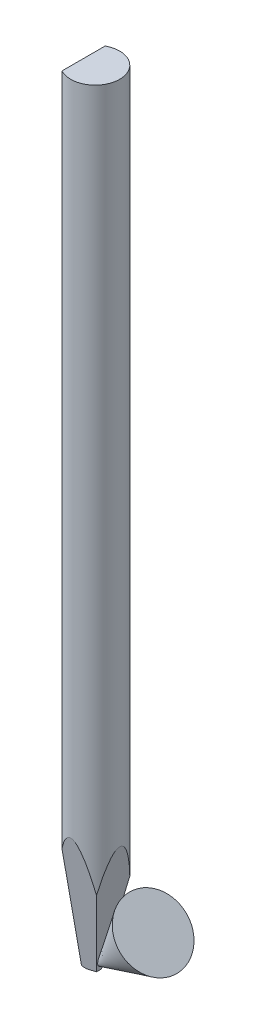
ISO-10303-21;
HEADER;
FILE_DESCRIPTION(('STEP AP214'),'2;1');
FILE_NAME('part.step','',(''),(''),'','','');
FILE_SCHEMA(('AUTOMOTIVE_DESIGN { 1 0 10303 214 1 1 1 1 }'));
ENDSEC;
DATA;
#1=APPLICATION_CONTEXT('core data for automotive mechanical design processes');
#2=APPLICATION_PROTOCOL_DEFINITION('international standard','automotive_design',2000,#1);
#3=PRODUCT_CONTEXT('',#1,'mechanical');
#4=PRODUCT('Part','Part','',(#3));
#5=PRODUCT_RELATED_PRODUCT_CATEGORY('part','',(#4));
#6=PRODUCT_DEFINITION_FORMATION('','',#4);
#7=PRODUCT_DEFINITION_CONTEXT('part definition',#1,'design');
#8=PRODUCT_DEFINITION('design','',#6,#7);
#9=PRODUCT_DEFINITION_SHAPE('','',#8);
#10=(LENGTH_UNIT() NAMED_UNIT(*) SI_UNIT(.MILLI.,.METRE.));
#11=(NAMED_UNIT(*) PLANE_ANGLE_UNIT() SI_UNIT($,.RADIAN.));
#12=(NAMED_UNIT(*) SI_UNIT($,.STERADIAN.) SOLID_ANGLE_UNIT());
#13=UNCERTAINTY_MEASURE_WITH_UNIT(LENGTH_MEASURE(1.E-05),#10,'distance_accuracy_value','');
#14=(GEOMETRIC_REPRESENTATION_CONTEXT(3) GLOBAL_UNCERTAINTY_ASSIGNED_CONTEXT((#13)) GLOBAL_UNIT_ASSIGNED_CONTEXT((#10,
#11,#12)) REPRESENTATION_CONTEXT('',''));
#15=CARTESIAN_POINT('',(0.,0.,0.));
#16=DIRECTION('',(0.,0.,1.));
#17=DIRECTION('',(1.,0.,0.));
#18=AXIS2_PLACEMENT_3D('',#15,#16,#17);
#19=CARTESIAN_POINT('',(-0.21082,0.,32.7173184204362));
#20=DIRECTION('',(-0.258819045102522,0.965925826289068,0.));
#21=DIRECTION('',(-0.965925826289068,-0.258819045102522,0.));
#22=AXIS2_PLACEMENT_3D('',#19,#20,#21);
#23=PLANE('',#22);
#24=DIRECTION('',(-0.965925826289068,-0.258819045102522,0.));
#25=VECTOR('',#24,1.);
#26=CARTESIAN_POINT('',(-0.21082,0.,0.0380999999999992));
#27=LINE('',#26,#25);
#28=CARTESIAN_POINT('',(-0.043939968,0.0447153698072801,0.0380999999999996));
#29=VERTEX_POINT('',#28);
#30=CARTESIAN_POINT('',(-0.198669324146965,0.00325576378231368,0.0381));
#31=VERTEX_POINT('',#30);
#32=EDGE_CURVE('E174',#29,#31,#27,.T.);
#33=ORIENTED_EDGE('',*,*,#32,.F.);
#34=DIRECTION('',(0.,0.,1.));
#35=VECTOR('',#34,1.);
#36=CARTESIAN_POINT('',(-0.0439399680000001,0.0447153698072801,32.7173184204362));
#37=LINE('',#36,#35);
#38=CARTESIAN_POINT('',(-0.043939968,0.0447153698072801,-0.0380999999999996));
#39=VERTEX_POINT('',#38);
#40=EDGE_CURVE('E12',#39,#29,#37,.T.);
#41=ORIENTED_EDGE('',*,*,#40,.F.);
#42=DIRECTION('',(-0.965925826289068,-0.258819045102522,0.));
#43=VECTOR('',#42,1.);
#44=CARTESIAN_POINT('',(-0.21082,0.,-0.0380999999999992));
#45=LINE('',#44,#43);
#46=CARTESIAN_POINT('',(-0.198669324146965,0.00325576378231368,-0.0381));
#47=VERTEX_POINT('',#46);
#48=EDGE_CURVE('E171',#39,#47,#45,.T.);
#49=ORIENTED_EDGE('',*,*,#48,.T.);
#50=CARTESIAN_POINT('',(-1.68012840293986,-0.3937,0.));
#51=DIRECTION('',(-0.258819045102522,0.965925826289068,0.));
#52=DIRECTION('',(-0.965925826289068,-0.258819045102522,0.));
#53=AXIS2_PLACEMENT_3D('',#50,#51,#52);
#54=ELLIPSE('',#53,1.54076760403021,0.39878);
#55=CARTESIAN_POINT('',(-0.210819999999997,0.,-0.063474589831864));
#56=VERTEX_POINT('',#55);
#57=EDGE_CURVE('E176',#47,#56,#54,.T.);
#58=ORIENTED_EDGE('',*,*,#57,.T.);
#59=DIRECTION('',(0.964921520309631,0.258549942126378,-0.0455893306574928));
#60=VECTOR('',#59,1.);
#61=CARTESIAN_POINT('',(30.0732612412349,8.11459511210743,-1.49432205578958));
#62=LINE('',#61,#60);
#63=CARTESIAN_POINT('',(0.12242470321684,0.0892926491088998,-0.0792447032168328));
#64=VERTEX_POINT('',#63);
#65=EDGE_CURVE('E262',#56,#64,#62,.T.);
#66=ORIENTED_EDGE('',*,*,#65,.T.);
#67=DIRECTION('',(0.,0.,-1.));
#68=VECTOR('',#67,1.);
#69=CARTESIAN_POINT('',(0.122424703216833,0.0892926491088998,32.7173184204362));
#70=LINE('',#69,#68);
#71=CARTESIAN_POINT('',(0.12242470321684,0.0892926491088998,0.0792447032168328));
#72=VERTEX_POINT('',#71);
#73=EDGE_CURVE('E228',#72,#64,#70,.T.);
#74=ORIENTED_EDGE('',*,*,#73,.F.);
#75=DIRECTION('',(-0.964921520309631,-0.258549942126378,-0.0455893306574928));
#76=VECTOR('',#75,1.);
#77=CARTESIAN_POINT('',(30.0732612412349,8.11459511210743,1.49432205578958));
#78=LINE('',#77,#76);
#79=CARTESIAN_POINT('',(-0.210819999999994,0.,0.063474589831864));
#80=VERTEX_POINT('',#79);
#81=EDGE_CURVE('E237',#72,#80,#78,.T.);
#82=ORIENTED_EDGE('',*,*,#81,.T.);
#83=EDGE_CURVE('E218',#80,#31,#54,.T.);
#84=ORIENTED_EDGE('',*,*,#83,.T.);
#85=EDGE_LOOP('',(#33,#41,#49,#58,#66,#74,#82,#84));
#86=FACE_BOUND('',#85,.T.);
#87=ADVANCED_FACE('F51',(#86),#23,.F.);
#88=CARTESIAN_POINT('',(32.267537028911,-0.3937,0.));
#89=DIRECTION('',(-1.,0.,0.));
#90=DIRECTION('',(0.,0.,1.));
#91=AXIS2_PLACEMENT_3D('',#88,#89,#90);
#92=CYLINDRICAL_SURFACE('',#91,0.39878);
#93=DIRECTION('',(-1.,0.,0.));
#94=VECTOR('',#93,1.);
#95=CARTESIAN_POINT('',(32.267537028911,0.00325576378231368,0.0381));
#96=LINE('',#95,#94);
#97=CARTESIAN_POINT('',(-0.213434975324446,0.00325576378231347,0.0381));
#98=VERTEX_POINT('',#97);
#99=EDGE_CURVE('E59',#31,#98,#96,.T.);
#100=ORIENTED_EDGE('',*,*,#99,.F.);
#101=ORIENTED_EDGE('',*,*,#83,.F.);
#102=CARTESIAN_POINT('',(-0.210819999999994,0.,0.0634491796637279));
#103=DIRECTION('',(-1.,0.,0.));
#104=VECTOR('',#103,1.);
#105=LINE('',#102,#104);
#106=CARTESIAN_POINT('',(-0.337820000000001,0.,0.0634745898318631));
#107=VERTEX_POINT('',#106);
#108=EDGE_CURVE('E74',#80,#107,#105,.T.);
#109=ORIENTED_EDGE('',*,*,#108,.T.);
#110=CARTESIAN_POINT('',(-0.33782,0.,-0.0634491796637279));
#111=CARTESIAN_POINT('',(-0.338215230170378,-2.1619663506246E-07,-0.0634504140289411));
#112=CARTESIAN_POINT('',(-0.338608680576224,6.1408026914369E-06,-0.0634110825976376));
#113=CARTESIAN_POINT('',(-0.339376539166161,2.9956330626349E-05,-0.0632630918013469));
#114=CARTESIAN_POINT('',(-0.339751136439136,4.72587329837486E-05,-0.0631554073575771));
#115=CARTESIAN_POINT('',(-0.340566424134218,9.63849822904999E-05,-0.0628484147691743));
#116=CARTESIAN_POINT('',(-0.341000799813187,0.000130729155729543,-0.0626331151866348));
#117=CARTESIAN_POINT('',(-0.341830879332213,0.000209401615022684,-0.0621364323829714));
#118=CARTESIAN_POINT('',(-0.342226343023016,0.000253786925260052,-0.0618546713159871));
#119=CARTESIAN_POINT('',(-0.343246193379579,0.000382750525198559,-0.0610290655842789));
#120=CARTESIAN_POINT('',(-0.343833692448088,0.000473486412576475,-0.0604412062287345));
#121=CARTESIAN_POINT('',(-0.344919050465909,0.000663233768986585,-0.0591907067245966));
#122=CARTESIAN_POINT('',(-0.345416712083611,0.000762262772703951,-0.0585279070337537));
#123=CARTESIAN_POINT('',(-0.347199317449133,0.00114717632260984,-0.0559014765020926));
#124=CARTESIAN_POINT('',(-0.348251269256303,0.00144216221478851,-0.0537847031790454));
#125=CARTESIAN_POINT('',(-0.350067330775089,0.00201087949910872,-0.0494307127625433));
#126=CARTESIAN_POINT('',(-0.350829658162979,0.00228447130814355,-0.047192843714313));
#127=CARTESIAN_POINT('',(-0.353601902976201,0.00334391714965828,-0.0378407235029386));
#128=CARTESIAN_POINT('',(-0.354816203935163,0.00398146647630368,-0.0304796839666097));
#129=CARTESIAN_POINT('',(-0.356420207927863,0.0048439888571872,-0.0156396189486946));
#130=CARTESIAN_POINT('',(-0.356804845155496,0.00506642619291586,-0.00816014797449113));
#131=CARTESIAN_POINT('',(-0.356850729381507,0.00509381728214254,0.00760774573397564));
#132=CARTESIAN_POINT('',(-0.356429012575582,0.00485088554254846,0.0158959420507874));
#133=CARTESIAN_POINT('',(-0.354573892929132,0.00385184669696223,0.0322958260830371));
#134=CARTESIAN_POINT('',(-0.353153510899978,0.00310234912265248,0.0404084150959362));
#135=CARTESIAN_POINT('',(-0.35013678994009,0.00204453529520439,0.0491211397037176));
#136=CARTESIAN_POINT('',(-0.349758655989933,0.00191644202880441,0.0501414810048737));
#137=CARTESIAN_POINT('',(-0.348937773713734,0.0016554554041729,0.0521591104339088));
#138=CARTESIAN_POINT('',(-0.348494839476784,0.00152254909191717,0.0531563223322797));
#139=CARTESIAN_POINT('',(-0.347469420243984,0.00123789714403849,0.0552338944388721));
#140=CARTESIAN_POINT('',(-0.346876413821046,0.00108587247117545,0.0563090757935718));
#141=CARTESIAN_POINT('',(-0.345551032354156,0.000786327429640935,0.0583702528176114));
#142=CARTESIAN_POINT('',(-0.344819355100165,0.000638788626588872,0.0593566600314393));
#143=CARTESIAN_POINT('',(-0.343649511930445,0.000447125744975873,0.0606108046377649));
#144=CARTESIAN_POINT('',(-0.343296857408712,0.000393842380942738,0.0609560541267325));
#145=CARTESIAN_POINT('',(-0.342551887573586,0.000293102249135745,0.0616038141185952));
#146=CARTESIAN_POINT('',(-0.342159521419922,0.000245653127084535,0.0619062686156061));
#147=CARTESIAN_POINT('',(-0.341325280448744,0.000159233790517246,0.0624537483118446));
#148=CARTESIAN_POINT('',(-0.340882694253593,0.000120416755111992,0.0626977411744304));
#149=CARTESIAN_POINT('',(-0.339957773274714,5.72497829757817E-05,0.0630932473964741));
#150=CARTESIAN_POINT('',(-0.339475683317333,3.28174315595638E-05,0.0632452877223534));
#151=CARTESIAN_POINT('',(-0.338791609164942,1.19029071700359E-05,0.06337528740311));
#152=CARTESIAN_POINT('',(-0.338598720198571,7.46593887915602E-06,0.0634028402213453));
#153=CARTESIAN_POINT('',(-0.338210609295611,1.50657797810939E-06,0.0634398324418317));
#154=CARTESIAN_POINT('',(-0.338015382206792,-7.30368063465796E-09,0.0634492189506669));
#155=CARTESIAN_POINT('',(-0.337820000000033,0.,0.0634491796639003));
#156=B_SPLINE_CURVE_WITH_KNOTS('',3,(#110,#111,#112,#113,#114,#115,#116,#117,#118,#119,#120,
#121,#122,#123,#124,#125,#126,#127,#128,#129,#130,#131,#132,#133,#134,#135,#136,#137,#138,#139,
#140,#141,#142,#143,#144,#145,#146,#147,#148,#149,#150,#151,#152,#153,#154,#155),.UNSPECIFIED.,
.F.,.F.,(4,2,2,2,2,2,2,2,2,2,2,2,2,2,2,2,2,2,2,2,2,2,4),(0.,0.00118082886348373,
0.00234518277421218,0.00379502494241527,0.00525331731965551,0.00774730261493331,
0.0102467011047661,0.0173371002717175,0.0244704523774037,0.0467777779045145,0.0692209276345487,
0.0940977103997022,0.118656018375932,0.121941221326841,0.125236041342339,0.128942534466866,
0.132630849292132,0.134117486211074,0.135606051047257,0.137119230412516,0.138623653705772,
0.13920758327759,0.139793210488499),.UNSPECIFIED.);
#157=CARTESIAN_POINT('',(-0.337820000000001,0.,-0.0634745898318645));
#158=VERTEX_POINT('',#157);
#159=EDGE_CURVE('E214',#158,#107,#156,.T.);
#160=ORIENTED_EDGE('',*,*,#159,.F.);
#161=CARTESIAN_POINT('',(-0.210820000000007,0.,-0.0635000000000002));
#162=DIRECTION('',(-1.,0.,0.));
#163=VECTOR('',#162,1.);
#164=LINE('',#161,#163);
#165=EDGE_CURVE('E242',#56,#158,#164,.T.);
#166=ORIENTED_EDGE('',*,*,#165,.F.);
#167=ORIENTED_EDGE('',*,*,#57,.F.);
#168=DIRECTION('',(-1.,0.,0.));
#169=VECTOR('',#168,1.);
#170=CARTESIAN_POINT('',(32.267537028911,0.00325576378231368,-0.0381));
#171=LINE('',#170,#169);
#172=CARTESIAN_POINT('',(-0.213434975324446,0.00325576378231446,-0.0381));
#173=VERTEX_POINT('',#172);
#174=EDGE_CURVE('E219',#47,#173,#171,.T.);
#175=ORIENTED_EDGE('',*,*,#174,.T.);
#176=CARTESIAN_POINT('',(-0.213434975324448,0.0032557637823121,-0.0381));
#177=CARTESIAN_POINT('',(-0.216677356144413,0.00325383969481455,-0.0381024345546639));
#178=CARTESIAN_POINT('',(-0.219929187359219,0.00328486987693439,-0.0377957846025672));
#179=CARTESIAN_POINT('',(-0.226328276823231,0.00340247139150545,-0.0365497108956549));
#180=CARTESIAN_POINT('',(-0.229474748255872,0.00348939100053903,-0.0356063174105322));
#181=CARTESIAN_POINT('',(-0.235038569200649,0.00369156598219943,-0.0332640592973628));
#182=CARTESIAN_POINT('',(-0.237494118474574,0.0038005228798271,-0.0319559953546052));
#183=CARTESIAN_POINT('',(-0.242096763884266,0.00403517428488462,-0.028889214713774));
#184=CARTESIAN_POINT('',(-0.244244911132795,0.00416080877937995,-0.0271320938616095));
#185=CARTESIAN_POINT('',(-0.247867020057944,0.00439245800745617,-0.0234685409816757));
#186=CARTESIAN_POINT('',(-0.249392685597249,0.00449885496890007,-0.0216132654121546));
#187=CARTESIAN_POINT('',(-0.252059477706641,0.00469451637626385,-0.0176417261337415));
#188=CARTESIAN_POINT('',(-0.253200739665995,0.00478378684945852,-0.0155255546734358));
#189=CARTESIAN_POINT('',(-0.254922624590094,0.0049223627266547,-0.0113782123586908));
#190=CARTESIAN_POINT('',(-0.255554874234946,0.00497522902986715,-0.00936849985669344));
#191=CARTESIAN_POINT('',(-0.256445735610066,0.00505046238868644,-0.00526776612211923));
#192=CARTESIAN_POINT('',(-0.256704586644332,0.00507284897763974,-0.00317679784811331));
#193=CARTESIAN_POINT('',(-0.256832033773111,0.00508382922425374,0.000870511032522582));
#194=CARTESIAN_POINT('',(-0.256726572149323,0.00507466940950495,0.00282607750329771));
#195=CARTESIAN_POINT('',(-0.256186703007007,0.00502855002735404,0.00669067553085059));
#196=CARTESIAN_POINT('',(-0.255752331354908,0.00499159349108511,0.00859971213811182));
#197=CARTESIAN_POINT('',(-0.254577692720403,0.00489447221036392,0.0123020389950609));
#198=CARTESIAN_POINT('',(-0.253840075814913,0.00483450881974658,0.0140961800945649));
#199=CARTESIAN_POINT('',(-0.252087432851536,0.00469770885428753,0.0175423096927673));
#200=CARTESIAN_POINT('',(-0.251072364768344,0.00462086972363786,0.0191942766065744));
#201=CARTESIAN_POINT('',(-0.248747537370778,0.00445412054850273,0.0223935712414367));
#202=CARTESIAN_POINT('',(-0.247426322164297,0.00436377040576979,0.0239325286663827));
#203=CARTESIAN_POINT('',(-0.244563703416135,0.0041817680138569,0.0267888028979574));
#204=CARTESIAN_POINT('',(-0.243022250556546,0.00409011547718224,0.0281060699170829));
#205=CARTESIAN_POINT('',(-0.239616689144949,0.00390558792775978,0.0306105478907787));
#206=CARTESIAN_POINT('',(-0.237736008509374,0.00381335175475867,0.0317752284066294));
#207=CARTESIAN_POINT('',(-0.233820769163239,0.00364533110349437,0.0338115681906488));
#208=CARTESIAN_POINT('',(-0.23178607425588,0.00356956142143786,0.0346829643063795));
#209=CARTESIAN_POINT('',(-0.227364937688427,0.00343283400813629,0.0362169384546261));
#210=CARTESIAN_POINT('',(-0.224965499517075,0.00337472372481431,0.0368421771277457));
#211=CARTESIAN_POINT('',(-0.220103176679321,0.00329161310799441,0.0377272958744222));
#212=CARTESIAN_POINT('',(-0.21764038982262,0.00326656452830056,0.0379877083647506));
#213=CARTESIAN_POINT('',(-0.21459447285549,0.00325668904295385,0.0380902897493966));
#214=CARTESIAN_POINT('',(-0.214014625789137,0.00325575167602871,0.0381000144233923));
#215=CARTESIAN_POINT('',(-0.213434975324448,0.00325576378231369,0.0381));
#216=B_SPLINE_CURVE_WITH_KNOTS('',3,(#176,#177,#178,#179,#180,#181,#182,#183,#184,#185,#186,
#187,#188,#189,#190,#191,#192,#193,#194,#195,#196,#197,#198,#199,#200,#201,#202,#203,#204,#205,
#206,#207,#208,#209,#210,#211,#212,#213,#214,#215),.UNSPECIFIED.,.F.,.F.,(4,2,2,2,2,2,2,2,2,2,2,
2,2,2,2,2,2,2,2,4),(0.,0.00972822348330293,0.0195176640268306,0.0278221058027812,
0.0360974362047185,0.0432692472929993,0.0504385297782022,0.056727673438183,0.06301278471331,
0.0688598408747795,0.074706259528079,0.0805026368509789,0.0862998926334656,0.0923652055792211,
0.0984318788679133,0.105047118690686,0.111668278379351,0.119079743158159,0.126480380552625,
0.128219781100697),.UNSPECIFIED.);
#217=EDGE_CURVE('E309',#173,#98,#216,.T.);
#218=ORIENTED_EDGE('',*,*,#217,.T.);
#219=EDGE_LOOP('',(#100,#101,#109,#160,#166,#167,#175,#218));
#220=FACE_BOUND('',#219,.T.);
#221=ADVANCED_FACE('F184',(#220),#92,.F.);
#222=CARTESIAN_POINT('',(32.315162028911,0.,0.0635));
#223=DIRECTION('',(0.,-0.173648177666931,0.984807753012208));
#224=DIRECTION('',(0.,-0.984807753012208,-0.173648177666931));
#225=AXIS2_PLACEMENT_3D('',#222,#223,#224);
#226=PLANE('',#225);
#227=CARTESIAN_POINT('',(-0.33782,0.0381,0.0702180579649908));
#228=DIRECTION('',(0.,-0.173648177666931,0.984807753012208));
#229=DIRECTION('',(0.,-0.984807753012208,-0.173648177666931));
#230=AXIS2_PLACEMENT_3D('',#227,#228,#229);
#231=ELLIPSE('',#230,0.0386877539128469,0.0381);
#232=CARTESIAN_POINT('',(-0.37592,0.0381,0.0702180579649908));
#233=VERTEX_POINT('',#232);
#234=EDGE_CURVE('E227',#107,#233,#231,.F.);
#235=ORIENTED_EDGE('',*,*,#234,.F.);
#236=ORIENTED_EDGE('',*,*,#108,.F.);
#237=ORIENTED_EDGE('',*,*,#81,.F.);
#238=DIRECTION('',(-0.171087869746036,-0.970287525247814,-0.171087869746036));
#239=VECTOR('',#238,1.);
#240=CARTESIAN_POINT('',(1.0494563833806,5.34675056303125,1.00627638338059));
#241=LINE('',#240,#239);
#242=CARTESIAN_POINT('',(0.581541914989137,2.69307574530669,0.538361914989131));
#243=VERTEX_POINT('',#242);
#244=EDGE_CURVE('E234',#243,#72,#241,.T.);
#245=ORIENTED_EDGE('',*,*,#244,.F.);
#246=CARTESIAN_POINT('',(0.,-0.360126395545723,0.));
#247=DIRECTION('',(0.,-0.173648177666931,0.984807753012208));
#248=DIRECTION('',(0.,-0.984807753012208,-0.173648177666931));
#249=AXIS2_PLACEMENT_3D('',#246,#247,#248);
#250=ELLIPSE('',#249,4.56371043248163,0.792479999999998);
#251=CARTESIAN_POINT('',(-0.37592,3.596415651605,0.69764511322018));
#252=VERTEX_POINT('',#251);
#253=EDGE_CURVE('E238',#243,#252,#250,.T.);
#254=ORIENTED_EDGE('',*,*,#253,.T.);
#255=DIRECTION('',(0.,0.984807753012208,0.173648177666931));
#256=VECTOR('',#255,1.);
#257=CARTESIAN_POINT('',(-0.37592,24.4442785246367,4.37368582784599));
#258=LINE('',#257,#256);
#259=EDGE_CURVE('E254',#233,#252,#258,.T.);
#260=ORIENTED_EDGE('',*,*,#259,.F.);
#261=EDGE_LOOP('',(#235,#236,#237,#245,#254,#260));
#262=FACE_BOUND('',#261,.T.);
#263=ADVANCED_FACE('F194',(#262),#226,.T.);
#264=CARTESIAN_POINT('',(32.315162028911,0.,-0.0635));
#265=DIRECTION('',(0.,-0.173648177666931,-0.984807753012208));
#266=DIRECTION('',(0.,0.984807753012208,-0.173648177666931));
#267=AXIS2_PLACEMENT_3D('',#264,#265,#266);
#268=PLANE('',#267);
#269=CARTESIAN_POINT('',(-0.33782,0.0381,-0.0702180579649908));
#270=DIRECTION('',(0.,-0.173648177666931,-0.984807753012208));
#271=DIRECTION('',(0.,0.984807753012208,-0.173648177666931));
#272=AXIS2_PLACEMENT_3D('',#269,#270,#271);
#273=ELLIPSE('',#272,0.0386877539128469,0.0381);
#274=CARTESIAN_POINT('',(-0.37592,0.0381,-0.0702180579649908));
#275=VERTEX_POINT('',#274);
#276=EDGE_CURVE('E301',#275,#158,#273,.F.);
#277=ORIENTED_EDGE('',*,*,#276,.F.);
#278=DIRECTION('',(0.,-0.984807753012208,0.173648177666931));
#279=VECTOR('',#278,1.);
#280=CARTESIAN_POINT('',(-0.37592,24.8021957642242,-4.43679629404595));
#281=LINE('',#280,#279);
#282=CARTESIAN_POINT('',(-0.37592,3.596415651605,-0.69764511322018));
#283=VERTEX_POINT('',#282);
#284=EDGE_CURVE('E256',#283,#275,#281,.T.);
#285=ORIENTED_EDGE('',*,*,#284,.F.);
#286=CARTESIAN_POINT('',(0.,-0.360126395545723,0.));
#287=DIRECTION('',(0.,-0.173648177666931,-0.984807753012208));
#288=DIRECTION('',(0.,-0.984807753012208,0.173648177666931));
#289=AXIS2_PLACEMENT_3D('',#286,#287,#288);
#290=ELLIPSE('',#289,4.56371043248163,0.792479999999998);
#291=CARTESIAN_POINT('',(0.581541914989137,2.69307574530669,-0.538361914989131));
#292=VERTEX_POINT('',#291);
#293=EDGE_CURVE('E241',#283,#292,#290,.T.);
#294=ORIENTED_EDGE('',*,*,#293,.T.);
#295=DIRECTION('',(0.171087869746036,0.970287525247814,-0.171087869746036));
#296=VECTOR('',#295,1.);
#297=CARTESIAN_POINT('',(1.0494563833806,5.34675056303125,-1.00627638338059));
#298=LINE('',#297,#296);
#299=EDGE_CURVE('E259',#64,#292,#298,.T.);
#300=ORIENTED_EDGE('',*,*,#299,.F.);
#301=ORIENTED_EDGE('',*,*,#65,.F.);
#302=ORIENTED_EDGE('',*,*,#165,.T.);
#303=EDGE_LOOP('',(#277,#285,#294,#300,#301,#302));
#304=FACE_BOUND('',#303,.T.);
#305=ADVANCED_FACE('F281',(#304),#268,.T.);
#306=CARTESIAN_POINT('',(0.,25.4,0.));
#307=DIRECTION('',(0.,-1.,0.));
#308=DIRECTION('',(0.,0.,-1.));
#309=AXIS2_PLACEMENT_3D('',#306,#307,#308);
#310=CYLINDRICAL_SURFACE('',#309,0.792479999999998);
#311=ORIENTED_EDGE('',*,*,#253,.F.);
#312=CARTESIAN_POINT('',(0.,-0.605012344516816,0.));
#313=DIRECTION('',(-0.984807753012208,0.173648177666931,0.));
#314=DIRECTION('',(-0.173648177666931,-0.984807753012208,0.));
#315=AXIS2_PLACEMENT_3D('',#312,#313,#314);
#316=ELLIPSE('',#315,4.56371043248165,0.792479999999998);
#317=EDGE_CURVE('E231',#243,#292,#316,.T.);
#318=ORIENTED_EDGE('',*,*,#317,.T.);
#319=ORIENTED_EDGE('',*,*,#293,.F.);
#320=DIRECTION('',(0.,-1.,0.));
#321=VECTOR('',#320,1.);
#322=CARTESIAN_POINT('',(-0.37592,25.4,-0.69764511322018));
#323=LINE('',#322,#321);
#324=CARTESIAN_POINT('',(-0.37592,25.4,-0.69764511322018));
#325=VERTEX_POINT('',#324);
#326=EDGE_CURVE('E248',#325,#283,#323,.T.);
#327=ORIENTED_EDGE('',*,*,#326,.F.);
#328=CARTESIAN_POINT('',(0.,25.4,0.));
#329=DIRECTION('',(0.,1.,0.));
#330=DIRECTION('',(0.,0.,1.));
#331=AXIS2_PLACEMENT_3D('',#328,#329,#330);
#332=CIRCLE('',#331,0.792479999999998);
#333=CARTESIAN_POINT('',(-0.37592,25.4,0.69764511322018));
#334=VERTEX_POINT('',#333);
#335=EDGE_CURVE('E251',#334,#325,#332,.T.);
#336=ORIENTED_EDGE('',*,*,#335,.F.);
#337=DIRECTION('',(0.,-1.,0.));
#338=VECTOR('',#337,1.);
#339=CARTESIAN_POINT('',(-0.37592,25.4,0.69764511322018));
#340=LINE('',#339,#338);
#341=EDGE_CURVE('E246',#252,#334,#340,.F.);
#342=ORIENTED_EDGE('',*,*,#341,.F.);
#343=EDGE_LOOP('',(#311,#318,#319,#327,#336,#342));
#344=FACE_BOUND('',#343,.T.);
#345=ADVANCED_FACE('F53',(#344),#310,.T.);
#346=CARTESIAN_POINT('',(-0.37592,25.4,-1.04648));
#347=DIRECTION('',(-1.,0.,0.));
#348=DIRECTION('',(0.,0.,1.));
#349=AXIS2_PLACEMENT_3D('',#346,#347,#348);
#350=PLANE('',#349);
#351=DIRECTION('',(0.,0.,-1.));
#352=VECTOR('',#351,1.);
#353=CARTESIAN_POINT('',(-0.37592,0.0381,31.924637028911));
#354=LINE('',#353,#352);
#355=EDGE_CURVE('E223',#233,#275,#354,.T.);
#356=ORIENTED_EDGE('',*,*,#355,.F.);
#357=ORIENTED_EDGE('',*,*,#259,.T.);
#358=ORIENTED_EDGE('',*,*,#341,.T.);
#359=DIRECTION('',(0.,0.,-1.));
#360=VECTOR('',#359,1.);
#361=CARTESIAN_POINT('',(-0.37592,25.4,-1.04648));
#362=LINE('',#361,#360);
#363=EDGE_CURVE('E244',#334,#325,#362,.T.);
#364=ORIENTED_EDGE('',*,*,#363,.T.);
#365=ORIENTED_EDGE('',*,*,#326,.T.);
#366=ORIENTED_EDGE('',*,*,#284,.T.);
#367=EDGE_LOOP('',(#356,#357,#358,#364,#365,#366));
#368=FACE_BOUND('',#367,.T.);
#369=ADVANCED_FACE('F286',(#368),#350,.T.);
#370=CARTESIAN_POINT('',(0.,25.4,0.));
#371=DIRECTION('',(0.,1.,0.));
#372=DIRECTION('',(0.,0.,1.));
#373=AXIS2_PLACEMENT_3D('',#370,#371,#372);
#374=PLANE('',#373);
#375=ORIENTED_EDGE('',*,*,#335,.T.);
#376=ORIENTED_EDGE('',*,*,#363,.F.);
#377=EDGE_LOOP('',(#375,#376));
#378=FACE_BOUND('',#377,.T.);
#379=ADVANCED_FACE('F337',(#378),#374,.T.);
#380=CARTESIAN_POINT('',(0.122424703216833,0.0892926491088998,32.7173184204362));
#381=DIRECTION('',(-0.984807753012208,0.173648177666931,0.));
#382=DIRECTION('',(-0.173648177666931,-0.984807753012208,0.));
#383=AXIS2_PLACEMENT_3D('',#380,#381,#382);
#384=PLANE('',#383);
#385=ORIENTED_EDGE('',*,*,#317,.F.);
#386=ORIENTED_EDGE('',*,*,#244,.T.);
#387=ORIENTED_EDGE('',*,*,#73,.T.);
#388=ORIENTED_EDGE('',*,*,#299,.T.);
#389=EDGE_LOOP('',(#385,#386,#387,#388));
#390=FACE_BOUND('',#389,.T.);
#391=ADVANCED_FACE('F326',(#390),#384,.F.);
#392=CARTESIAN_POINT('',(-0.33782,0.0381,31.924637028911));
#393=DIRECTION('',(0.,0.,-1.));
#394=DIRECTION('',(-1.,0.,0.));
#395=AXIS2_PLACEMENT_3D('',#392,#393,#394);
#396=CYLINDRICAL_SURFACE('',#395,0.0381);
#397=ORIENTED_EDGE('',*,*,#276,.T.);
#398=ORIENTED_EDGE('',*,*,#159,.T.);
#399=ORIENTED_EDGE('',*,*,#234,.T.);
#400=ORIENTED_EDGE('',*,*,#355,.T.);
#401=EDGE_LOOP('',(#397,#398,#399,#400));
#402=FACE_BOUND('',#401,.T.);
#403=ADVANCED_FACE('F199',(#402),#396,.T.);
#404=CARTESIAN_POINT('',(-0.0439399680000001,0.1016,0.0381));
#405=DIRECTION('',(-1.,0.,0.));
#406=DIRECTION('',(0.,0.,1.));
#407=AXIS2_PLACEMENT_3D('',#404,#405,#406);
#408=PLANE('',#407);
#409=ORIENTED_EDGE('',*,*,#40,.T.);
#410=DIRECTION('',(0.,1.,0.));
#411=VECTOR('',#410,1.);
#412=CARTESIAN_POINT('',(-0.0439399680000001,0.1016,0.0381));
#413=LINE('',#412,#411);
#414=CARTESIAN_POINT('',(-0.0439399680000001,0.1016,0.0381));
#415=VERTEX_POINT('',#414);
#416=EDGE_CURVE('E140',#29,#415,#413,.T.);
#417=ORIENTED_EDGE('',*,*,#416,.T.);
#418=DIRECTION('',(0.,0.,-1.));
#419=VECTOR('',#418,1.);
#420=CARTESIAN_POINT('',(-0.0439399680000001,0.1016,0.0381));
#421=LINE('',#420,#419);
#422=CARTESIAN_POINT('',(-0.0439399680000001,0.1016,-0.0381));
#423=VERTEX_POINT('',#422);
#424=EDGE_CURVE('E144',#415,#423,#421,.T.);
#425=ORIENTED_EDGE('',*,*,#424,.T.);
#426=DIRECTION('',(0.,1.,0.));
#427=VECTOR('',#426,1.);
#428=CARTESIAN_POINT('',(-0.0439399680000001,0.1016,-0.0381));
#429=LINE('',#428,#427);
#430=EDGE_CURVE('E162',#39,#423,#429,.T.);
#431=ORIENTED_EDGE('',*,*,#430,.F.);
#432=EDGE_LOOP('',(#409,#417,#425,#431));
#433=FACE_BOUND('',#432,.T.);
#434=ADVANCED_FACE('F142',(#433),#408,.T.);
#435=CARTESIAN_POINT('',(-0.154343796672895,0.1016,0.));
#436=DIRECTION('',(-0.515038074910058,-0.85716730070211,0.));
#437=DIRECTION('',(0.85716730070211,-0.515038074910058,0.));
#438=AXIS2_PLACEMENT_3D('',#435,#436,#437);
#439=CYLINDRICAL_SURFACE('',#438,0.0381);
#440=DIRECTION('',(0.515038074910058,0.85716730070211,0.));
#441=VECTOR('',#440,1.);
#442=CARTESIAN_POINT('',(-0.154343796672895,0.1016,-0.0381));
#443=LINE('',#442,#441);
#444=CARTESIAN_POINT('',(-0.154343796672895,0.1016,-0.0381));
#445=VERTEX_POINT('',#444);
#446=EDGE_CURVE('E66',#173,#445,#443,.T.);
#447=ORIENTED_EDGE('',*,*,#446,.T.);
#448=CARTESIAN_POINT('',(-0.154343796672895,0.1016,0.));
#449=DIRECTION('',(0.,-1.,0.));
#450=DIRECTION('',(-1.,0.,0.));
#451=AXIS2_PLACEMENT_3D('',#448,#449,#450);
#452=ELLIPSE('',#451,0.0444487324339042,0.0381);
#453=CARTESIAN_POINT('',(-0.154343796672895,0.1016,0.0381));
#454=VERTEX_POINT('',#453);
#455=EDGE_CURVE('E169',#445,#454,#452,.F.);
#456=ORIENTED_EDGE('',*,*,#455,.T.);
#457=DIRECTION('',(-0.515038074910058,-0.85716730070211,0.));
#458=VECTOR('',#457,1.);
#459=CARTESIAN_POINT('',(-0.158255647768847,0.0950895864829977,0.0381));
#460=LINE('',#459,#458);
#461=EDGE_CURVE('E157',#454,#98,#460,.T.);
#462=ORIENTED_EDGE('',*,*,#461,.T.);
#463=ORIENTED_EDGE('',*,*,#217,.F.);
#464=EDGE_LOOP('',(#447,#456,#462,#463));
#465=FACE_BOUND('',#464,.T.);
#466=ADVANCED_FACE('F196',(#465),#439,.F.);
#467=CARTESIAN_POINT('',(0.,0.,0.0381));
#468=DIRECTION('',(0.,0.,-1.));
#469=DIRECTION('',(-1.,0.,0.));
#470=AXIS2_PLACEMENT_3D('',#467,#468,#469);
#471=PLANE('',#470);
#472=ORIENTED_EDGE('',*,*,#32,.T.);
#473=ORIENTED_EDGE('',*,*,#99,.T.);
#474=ORIENTED_EDGE('',*,*,#461,.F.);
#475=DIRECTION('',(-1.,0.,0.));
#476=VECTOR('',#475,1.);
#477=CARTESIAN_POINT('',(-0.198792529106799,0.1016,0.0381));
#478=LINE('',#477,#476);
#479=EDGE_CURVE('E150',#415,#454,#478,.T.);
#480=ORIENTED_EDGE('',*,*,#479,.F.);
#481=ORIENTED_EDGE('',*,*,#416,.F.);
#482=EDGE_LOOP('',(#472,#473,#474,#480,#481));
#483=FACE_BOUND('',#482,.T.);
#484=ADVANCED_FACE('F160',(#483),#471,.T.);
#485=CARTESIAN_POINT('',(0.,0.,-0.0381));
#486=DIRECTION('',(0.,0.,-1.));
#487=DIRECTION('',(-1.,0.,0.));
#488=AXIS2_PLACEMENT_3D('',#485,#486,#487);
#489=PLANE('',#488);
#490=ORIENTED_EDGE('',*,*,#430,.T.);
#491=DIRECTION('',(-1.,0.,0.));
#492=VECTOR('',#491,1.);
#493=CARTESIAN_POINT('',(-0.198792529106799,0.1016,-0.0381));
#494=LINE('',#493,#492);
#495=EDGE_CURVE('E156',#423,#445,#494,.T.);
#496=ORIENTED_EDGE('',*,*,#495,.T.);
#497=ORIENTED_EDGE('',*,*,#446,.F.);
#498=ORIENTED_EDGE('',*,*,#174,.F.);
#499=ORIENTED_EDGE('',*,*,#48,.F.);
#500=EDGE_LOOP('',(#490,#496,#497,#498,#499));
#501=FACE_BOUND('',#500,.T.);
#502=ADVANCED_FACE('F319',(#501),#489,.F.);
#503=CARTESIAN_POINT('',(-0.198792529106799,0.1016,0.0381));
#504=DIRECTION('',(0.,-1.,0.));
#505=DIRECTION('',(0.,0.,-1.));
#506=AXIS2_PLACEMENT_3D('',#503,#504,#505);
#507=PLANE('',#506);
#508=ORIENTED_EDGE('',*,*,#495,.F.);
#509=ORIENTED_EDGE('',*,*,#424,.F.);
#510=ORIENTED_EDGE('',*,*,#479,.T.);
#511=ORIENTED_EDGE('',*,*,#455,.F.);
#512=EDGE_LOOP('',(#508,#509,#510,#511));
#513=FACE_BOUND('',#512,.T.);
#514=ADVANCED_FACE('F154',(#513),#507,.T.);
#515=CLOSED_SHELL('',(#87,#221,#263,#305,#345,#369,#379,#391,#403,#434,#466,#484,#502,#514));
#516=MANIFOLD_SOLID_BREP('B2',#515);
#517=CARTESIAN_POINT('',(0.107862981324313,0.253402949324312,0.));
#518=DIRECTION('',(0.707106781186551,0.707106781186544,0.));
#519=DIRECTION('',(-0.707106781186544,0.707106781186551,0.));
#520=AXIS2_PLACEMENT_3D('',#517,#518,#519);
#521=CONICAL_SURFACE('',#520,0.04445,0.392699081698725);
#522=CARTESIAN_POINT('',(1.87562639875679,2.02116636675677,0.));
#523=DIRECTION('',(0.707106781186551,0.707106781186544,0.));
#524=DIRECTION('',(-0.707106781186544,0.707106781186551,0.));
#525=AXIS2_PLACEMENT_3D('',#522,#523,#524);
#526=CIRCLE('',#525,1.07998183486493);
#527=CARTESIAN_POINT('',(1.11196391976551,2.78482884574805,0.));
#528=VERTEX_POINT('',#527);
#529=EDGE_CURVE('E50',#528,#528,#526,.T.);
#530=CARTESIAN_POINT('',(0.107862981324313,0.253402949324312,0.));
#531=DIRECTION('',(0.707106781186551,0.707106781186544,0.));
#532=DIRECTION('',(-0.707106781186544,0.707106781186551,0.));
#533=AXIS2_PLACEMENT_3D('',#530,#531,#532);
#534=CIRCLE('',#533,0.04445);
#535=CARTESIAN_POINT('',(0.0764320849005714,0.284833845748054,0.));
#536=VERTEX_POINT('',#535);
#537=EDGE_CURVE('E490',#536,#536,#534,.T.);
#538=CARTESIAN_POINT('',(1.11196391976551,2.78482884574805,0.));
#539=CARTESIAN_POINT('',(1.101177129819,2.75878723116472,0.));
#540=CARTESIAN_POINT('',(1.09039033987249,2.73274561658139,0.));
#541=CARTESIAN_POINT('',(1.06881675997947,2.68066238741472,0.));
#542=CARTESIAN_POINT('',(1.05802997003296,2.65462077283139,0.));
#543=CARTESIAN_POINT('',(1.03645639013994,2.60253754366472,0.));
#544=CARTESIAN_POINT('',(1.02566960019343,2.57649592908139,0.));
#545=CARTESIAN_POINT('',(1.00409602030041,2.52441269991472,0.));
#546=CARTESIAN_POINT('',(0.993309230353901,2.49837108533139,0.));
#547=CARTESIAN_POINT('',(0.971735650460882,2.44628785616472,0.));
#548=CARTESIAN_POINT('',(0.960948860514372,2.42024624158139,0.));
#549=CARTESIAN_POINT('',(0.939375280621353,2.36816301241472,0.));
#550=CARTESIAN_POINT('',(0.928588490674843,2.34212139783139,0.));
#551=CARTESIAN_POINT('',(0.907014910781823,2.29003816866472,0.));
#552=CARTESIAN_POINT('',(0.896228120835313,2.26399655408139,0.));
#553=CARTESIAN_POINT('',(0.874654540942294,2.21191332491472,0.));
#554=CARTESIAN_POINT('',(0.863867750995784,2.18587171033139,0.));
#555=CARTESIAN_POINT('',(0.842294171102765,2.13378848116472,0.));
#556=CARTESIAN_POINT('',(0.831507381156255,2.10774686658139,0.));
#557=CARTESIAN_POINT('',(0.809933801263236,2.05566363741472,0.));
#558=CARTESIAN_POINT('',(0.799147011316726,2.02962202283139,0.));
#559=CARTESIAN_POINT('',(0.777573431423706,1.97753879366472,0.));
#560=CARTESIAN_POINT('',(0.766786641477196,1.95149717908139,0.));
#561=CARTESIAN_POINT('',(0.745213061584177,1.89941394991472,0.));
#562=CARTESIAN_POINT('',(0.734426271637667,1.87337233533139,0.));
#563=CARTESIAN_POINT('',(0.712852691744647,1.82128910616472,0.));
#564=CARTESIAN_POINT('',(0.702065901798138,1.79524749158139,0.));
#565=CARTESIAN_POINT('',(0.680492321905118,1.74316426241472,0.));
#566=CARTESIAN_POINT('',(0.669705531958608,1.71712264783139,0.));
#567=CARTESIAN_POINT('',(0.648131952065589,1.66503941866472,0.));
#568=CARTESIAN_POINT('',(0.637345162119079,1.63899780408139,0.));
#569=CARTESIAN_POINT('',(0.61577158222606,1.58691457491472,0.));
#570=CARTESIAN_POINT('',(0.60498479227955,1.56087296033139,0.));
#571=CARTESIAN_POINT('',(0.58341121238653,1.50878973116472,0.));
#572=CARTESIAN_POINT('',(0.572624422440021,1.48274811658139,0.));
#573=CARTESIAN_POINT('',(0.551050842547001,1.43066488741472,0.));
#574=CARTESIAN_POINT('',(0.540264052600491,1.40462327283139,0.));
#575=CARTESIAN_POINT('',(0.518690472707472,1.35254004366472,0.));
#576=CARTESIAN_POINT('',(0.507903682760962,1.32649842908139,0.));
#577=CARTESIAN_POINT('',(0.486330102867942,1.27441519991472,0.));
#578=CARTESIAN_POINT('',(0.475543312921433,1.24837358533139,0.));
#579=CARTESIAN_POINT('',(0.453969733028413,1.19629035616472,0.));
#580=CARTESIAN_POINT('',(0.443182943081903,1.17024874158139,0.));
#581=CARTESIAN_POINT('',(0.421609363188884,1.11816551241472,0.));
#582=CARTESIAN_POINT('',(0.410822573242374,1.09212389783139,0.));
#583=CARTESIAN_POINT('',(0.389248993349355,1.04004066866472,0.));
#584=CARTESIAN_POINT('',(0.378462203402845,1.01399905408139,0.));
#585=CARTESIAN_POINT('',(0.356888623509825,0.96191582491472,0.));
#586=CARTESIAN_POINT('',(0.346101833563316,0.935874210331387,0.));
#587=CARTESIAN_POINT('',(0.324528253670296,0.88379098116472,0.));
#588=CARTESIAN_POINT('',(0.313741463723786,0.857749366581387,0.));
#589=CARTESIAN_POINT('',(0.292167883830767,0.80566613741472,0.));
#590=CARTESIAN_POINT('',(0.281381093884257,0.779624522831387,0.));
#591=CARTESIAN_POINT('',(0.259807513991237,0.72754129366472,0.));
#592=CARTESIAN_POINT('',(0.249020724044728,0.701499679081387,0.));
#593=CARTESIAN_POINT('',(0.227447144151708,0.64941644991472,0.));
#594=CARTESIAN_POINT('',(0.216660354205198,0.623374835331387,0.));
#595=CARTESIAN_POINT('',(0.195086774312179,0.571291606164721,0.));
#596=CARTESIAN_POINT('',(0.184299984365669,0.545249991581387,0.));
#597=CARTESIAN_POINT('',(0.16272640447265,0.493166762414721,0.));
#598=CARTESIAN_POINT('',(0.15193961452614,0.467125147831387,0.));
#599=CARTESIAN_POINT('',(0.13036603463312,0.415041918664721,0.));
#600=CARTESIAN_POINT('',(0.119579244686611,0.389000304081387,0.));
#601=CARTESIAN_POINT('',(0.098005664793591,0.336917074914721,0.));
#602=CARTESIAN_POINT('',(0.0872188748470812,0.310875460331388,0.));
#603=CARTESIAN_POINT('',(0.0764320849005715,0.284833845748054,0.));
#604=B_SPLINE_CURVE_WITH_KNOTS('',3,(#538,#539,#540,#541,#542,#543,#544,#545,#546,#547,#548,
#549,#550,#551,#552,#553,#554,#555,#556,#557,#558,#559,#560,#561,#562,#563,#564,#565,#566,#567,
#568,#569,#570,#571,#572,#573,#574,#575,#576,#577,#578,#579,#580,#581,#582,#583,#584,#585,#586,
#587,#588,#589,#590,#591,#592,#593,#594,#595,#596,#597,#598,#599,#600,#601,#602,#603),
.UNSPECIFIED.,.F.,.F.,(4,2,2,2,2,2,2,2,2,2,2,2,2,2,2,2,2,2,2,2,2,2,2,2,2,2,2,2,2,2,2,2,4),(0.,
0.084561721524062,0.169123443048124,0.253685164572186,0.338246886096248,0.42280860762031,
0.507370329144372,0.591932050668434,0.676493772192496,0.761055493716558,0.845617215240621,
0.930178936764682,1.01474065828874,1.09930237981281,1.18386410133687,1.26842582286093,
1.35298754438499,1.43754926590905,1.52211098743312,1.60667270895718,1.69123443048124,
1.7757961520053,1.86035787352936,1.94491959505343,2.02948131657749,2.11404303810155,
2.19860475962561,2.28316648114967,2.36772820267374,2.4522899241978,2.53685164572186,
2.62141336724592,2.70597508876999),.UNSPECIFIED.);
#605=EDGE_CURVE('BSEAM484',#528,#536,#604,.T.);
#606=ORIENTED_EDGE('',*,*,#529,.F.);
#607=ORIENTED_EDGE('',*,*,#537,.T.);
#608=ORIENTED_EDGE('',*,*,#605,.T.);
#609=ORIENTED_EDGE('',*,*,#605,.F.);
#610=EDGE_LOOP('',(#606,#608,#607,#609));
#611=FACE_BOUND('',#610,.T.);
#612=ADVANCED_FACE('F484',(#611),#521,.T.);
#613=CARTESIAN_POINT('',(1.87562639875679,2.02116636675677,0.));
#614=DIRECTION('',(0.707106781186551,0.707106781186544,0.));
#615=DIRECTION('',(-0.707106781186544,0.707106781186551,0.));
#616=AXIS2_PLACEMENT_3D('',#613,#614,#615);
#617=PLANE('',#616);
#618=ORIENTED_EDGE('',*,*,#529,.T.);
#619=EDGE_LOOP('',(#618));
#620=FACE_BOUND('',#619,.T.);
#621=ADVANCED_FACE('F499',(#620),#617,.T.);
#622=CARTESIAN_POINT('',(0.107862981324313,0.253402949324312,0.));
#623=DIRECTION('',(0.707106781186551,0.707106781186544,0.));
#624=DIRECTION('',(-0.707106781186544,0.707106781186551,0.));
#625=AXIS2_PLACEMENT_3D('',#622,#623,#624);
#626=PLANE('',#625);
#627=ORIENTED_EDGE('',*,*,#537,.F.);
#628=EDGE_LOOP('',(#627));
#629=FACE_BOUND('',#628,.T.);
#630=ADVANCED_FACE('F497',(#629),#626,.F.);
#631=CLOSED_SHELL('',(#612,#621,#630));
#632=MANIFOLD_SOLID_BREP('B6',#631);
#633=ADVANCED_BREP_SHAPE_REPRESENTATION('',(#18,#516,#632),#14);
#634=SHAPE_DEFINITION_REPRESENTATION(#9,#633);
ENDSEC;
END-ISO-10303-21;
